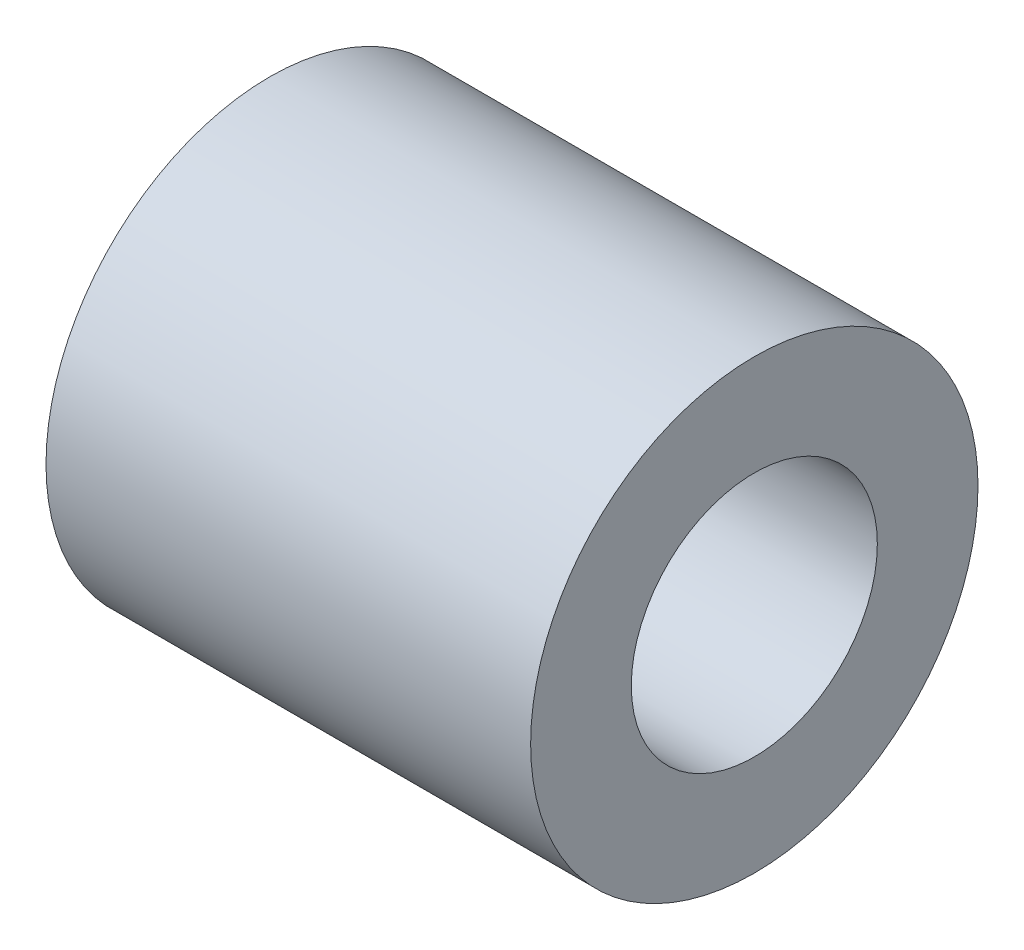
ISO-10303-21;
HEADER;
FILE_DESCRIPTION(('STEP AP214'),'2;1');
FILE_NAME('part.step','',(''),(''),'','','');
FILE_SCHEMA(('AUTOMOTIVE_DESIGN { 1 0 10303 214 1 1 1 1 }'));
ENDSEC;
DATA;
#1=APPLICATION_CONTEXT('core data for automotive mechanical design processes');
#2=APPLICATION_PROTOCOL_DEFINITION('international standard','automotive_design',2000,#1);
#3=PRODUCT_CONTEXT('',#1,'mechanical');
#4=PRODUCT('Part','Part','',(#3));
#5=PRODUCT_RELATED_PRODUCT_CATEGORY('part','',(#4));
#6=PRODUCT_DEFINITION_FORMATION('','',#4);
#7=PRODUCT_DEFINITION_CONTEXT('part definition',#1,'design');
#8=PRODUCT_DEFINITION('design','',#6,#7);
#9=PRODUCT_DEFINITION_SHAPE('','',#8);
#10=(LENGTH_UNIT() NAMED_UNIT(*) SI_UNIT(.MILLI.,.METRE.));
#11=(NAMED_UNIT(*) PLANE_ANGLE_UNIT() SI_UNIT($,.RADIAN.));
#12=(NAMED_UNIT(*) SI_UNIT($,.STERADIAN.) SOLID_ANGLE_UNIT());
#13=UNCERTAINTY_MEASURE_WITH_UNIT(LENGTH_MEASURE(1.E-05),#10,'distance_accuracy_value','');
#14=(GEOMETRIC_REPRESENTATION_CONTEXT(3) GLOBAL_UNCERTAINTY_ASSIGNED_CONTEXT((#13)) GLOBAL_UNIT_ASSIGNED_CONTEXT((#10,
#11,#12)) REPRESENTATION_CONTEXT('',''));
#15=CARTESIAN_POINT('',(0.,0.,0.));
#16=DIRECTION('',(0.,0.,1.));
#17=DIRECTION('',(1.,0.,0.));
#18=AXIS2_PLACEMENT_3D('',#15,#16,#17);
#19=CARTESIAN_POINT('',(-23.,170.5,175.));
#20=DIRECTION('',(1.,0.,0.));
#21=DIRECTION('',(0.,0.,-1.));
#22=AXIS2_PLACEMENT_3D('',#19,#20,#21);
#23=CYLINDRICAL_SURFACE('',#22,1.65);
#24=CARTESIAN_POINT('',(-23.,170.5,175.));
#25=DIRECTION('',(-1.,0.,0.));
#26=DIRECTION('',(0.,0.,1.));
#27=AXIS2_PLACEMENT_3D('',#24,#25,#26);
#28=CIRCLE('',#27,1.65);
#29=CARTESIAN_POINT('',(-23.,170.5,176.65));
#30=VERTEX_POINT('',#29);
#31=EDGE_CURVE('E9',#30,#30,#28,.T.);
#32=ORIENTED_EDGE('',*,*,#31,.T.);
#33=EDGE_LOOP('',(#32));
#34=FACE_BOUND('',#33,.T.);
#35=CARTESIAN_POINT('',(-16.5,170.5,175.));
#36=DIRECTION('',(-1.,0.,0.));
#37=DIRECTION('',(0.,0.,1.));
#38=AXIS2_PLACEMENT_3D('',#35,#36,#37);
#39=CIRCLE('',#38,1.65);
#40=CARTESIAN_POINT('',(-16.5,170.5,176.65));
#41=VERTEX_POINT('',#40);
#42=EDGE_CURVE('E18',#41,#41,#39,.T.);
#43=ORIENTED_EDGE('',*,*,#42,.F.);
#44=EDGE_LOOP('',(#43));
#45=FACE_BOUND('',#44,.T.);
#46=ADVANCED_FACE('F14',(#34,#45),#23,.F.);
#47=CARTESIAN_POINT('',(-23.,170.5,175.));
#48=DIRECTION('',(1.,0.,0.));
#49=DIRECTION('',(0.,0.,-1.));
#50=AXIS2_PLACEMENT_3D('',#47,#48,#49);
#51=CYLINDRICAL_SURFACE('',#50,3.);
#52=CARTESIAN_POINT('',(-23.,170.5,175.));
#53=DIRECTION('',(-1.,0.,0.));
#54=DIRECTION('',(0.,0.,1.));
#55=AXIS2_PLACEMENT_3D('',#52,#53,#54);
#56=CIRCLE('',#55,3.);
#57=CARTESIAN_POINT('',(-23.,170.5,178.));
#58=VERTEX_POINT('',#57);
#59=EDGE_CURVE('E23',#58,#58,#56,.T.);
#60=ORIENTED_EDGE('',*,*,#59,.F.);
#61=EDGE_LOOP('',(#60));
#62=FACE_BOUND('',#61,.T.);
#63=CARTESIAN_POINT('',(-16.5,170.5,175.));
#64=DIRECTION('',(-1.,0.,0.));
#65=DIRECTION('',(0.,0.,1.));
#66=AXIS2_PLACEMENT_3D('',#63,#64,#65);
#67=CIRCLE('',#66,3.);
#68=CARTESIAN_POINT('',(-16.5,170.5,178.));
#69=VERTEX_POINT('',#68);
#70=EDGE_CURVE('E34',#69,#69,#67,.T.);
#71=ORIENTED_EDGE('',*,*,#70,.T.);
#72=EDGE_LOOP('',(#71));
#73=FACE_BOUND('',#72,.T.);
#74=ADVANCED_FACE('F16',(#62,#73),#51,.T.);
#75=CARTESIAN_POINT('',(-23.,141.,171.));
#76=DIRECTION('',(-1.,0.,0.));
#77=DIRECTION('',(0.,-1.,0.));
#78=AXIS2_PLACEMENT_3D('',#75,#76,#77);
#79=PLANE('',#78);
#80=ORIENTED_EDGE('',*,*,#31,.F.);
#81=EDGE_LOOP('',(#80));
#82=FACE_BOUND('',#81,.T.);
#83=ORIENTED_EDGE('',*,*,#59,.T.);
#84=EDGE_LOOP('',(#83));
#85=FACE_BOUND('',#84,.T.);
#86=ADVANCED_FACE('F52',(#82,#85),#79,.T.);
#87=CARTESIAN_POINT('',(-16.5,141.,171.));
#88=DIRECTION('',(-1.,0.,0.));
#89=DIRECTION('',(0.,-1.,0.));
#90=AXIS2_PLACEMENT_3D('',#87,#88,#89);
#91=PLANE('',#90);
#92=ORIENTED_EDGE('',*,*,#42,.T.);
#93=EDGE_LOOP('',(#92));
#94=FACE_BOUND('',#93,.T.);
#95=ORIENTED_EDGE('',*,*,#70,.F.);
#96=EDGE_LOOP('',(#95));
#97=FACE_BOUND('',#96,.T.);
#98=ADVANCED_FACE('F44',(#94,#97),#91,.F.);
#99=CLOSED_SHELL('',(#46,#74,#86,#98));
#100=MANIFOLD_SOLID_BREP('B1',#99);
#101=ADVANCED_BREP_SHAPE_REPRESENTATION('',(#18,#100),#14);
#102=SHAPE_DEFINITION_REPRESENTATION(#9,#101);
ENDSEC;
END-ISO-10303-21;
